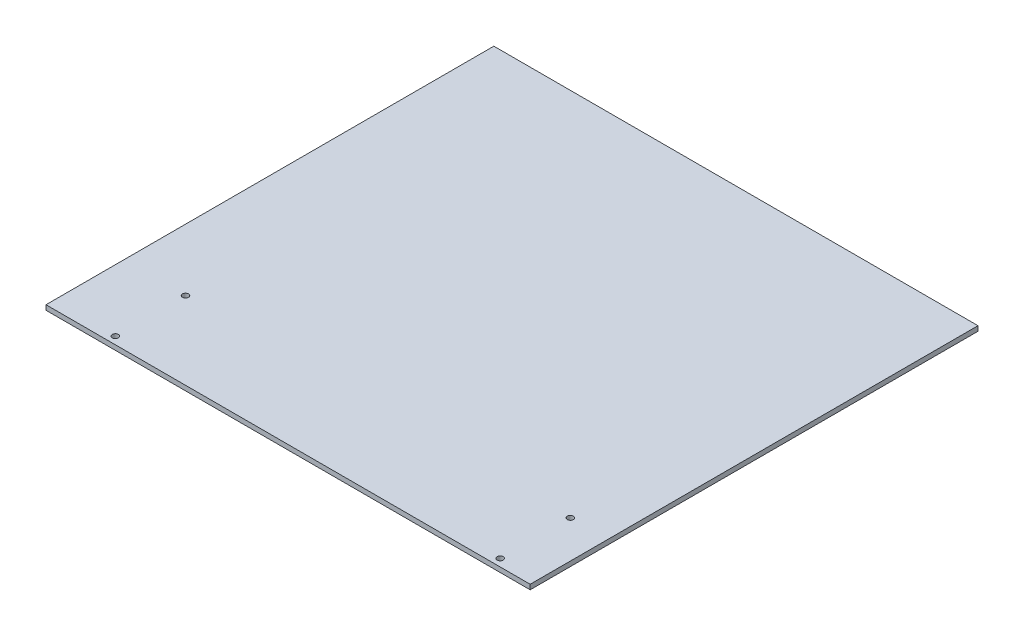
ISO-10303-21;
HEADER;
FILE_DESCRIPTION(('STEP AP214'),'2;1');
FILE_NAME('part.step','',(''),(''),'','','');
FILE_SCHEMA(('AUTOMOTIVE_DESIGN { 1 0 10303 214 1 1 1 1 }'));
ENDSEC;
DATA;
#1=APPLICATION_CONTEXT('core data for automotive mechanical design processes');
#2=APPLICATION_PROTOCOL_DEFINITION('international standard','automotive_design',2000,#1);
#3=PRODUCT_CONTEXT('',#1,'mechanical');
#4=PRODUCT('Part','Part','',(#3));
#5=PRODUCT_RELATED_PRODUCT_CATEGORY('part','',(#4));
#6=PRODUCT_DEFINITION_FORMATION('','',#4);
#7=PRODUCT_DEFINITION_CONTEXT('part definition',#1,'design');
#8=PRODUCT_DEFINITION('design','',#6,#7);
#9=PRODUCT_DEFINITION_SHAPE('','',#8);
#10=(LENGTH_UNIT() NAMED_UNIT(*) SI_UNIT(.MILLI.,.METRE.));
#11=(NAMED_UNIT(*) PLANE_ANGLE_UNIT() SI_UNIT($,.RADIAN.));
#12=(NAMED_UNIT(*) SI_UNIT($,.STERADIAN.) SOLID_ANGLE_UNIT());
#13=UNCERTAINTY_MEASURE_WITH_UNIT(LENGTH_MEASURE(1.E-05),#10,'distance_accuracy_value','');
#14=(GEOMETRIC_REPRESENTATION_CONTEXT(3) GLOBAL_UNCERTAINTY_ASSIGNED_CONTEXT((#13)) GLOBAL_UNIT_ASSIGNED_CONTEXT((#10,
#11,#12)) REPRESENTATION_CONTEXT('',''));
#15=CARTESIAN_POINT('',(0.,0.,0.));
#16=DIRECTION('',(0.,0.,1.));
#17=DIRECTION('',(1.,0.,0.));
#18=AXIS2_PLACEMENT_3D('',#15,#16,#17);
#19=CARTESIAN_POINT('',(100.,2.,92.5));
#20=DIRECTION('',(-1.,0.,0.));
#21=DIRECTION('',(0.,0.,1.));
#22=AXIS2_PLACEMENT_3D('',#19,#20,#21);
#23=PLANE('',#22);
#24=DIRECTION('',(0.,0.,-1.));
#25=VECTOR('',#24,1.);
#26=CARTESIAN_POINT('',(100.,0.,92.5));
#27=LINE('',#26,#25);
#28=CARTESIAN_POINT('',(100.,0.,92.5));
#29=VERTEX_POINT('',#28);
#30=CARTESIAN_POINT('',(100.,0.,-92.5));
#31=VERTEX_POINT('',#30);
#32=EDGE_CURVE('E95',#29,#31,#27,.T.);
#33=ORIENTED_EDGE('',*,*,#32,.T.);
#34=DIRECTION('',(0.,-1.,0.));
#35=VECTOR('',#34,1.);
#36=CARTESIAN_POINT('',(100.,2.,-92.5));
#37=LINE('',#36,#35);
#38=CARTESIAN_POINT('',(100.,2.,-92.5));
#39=VERTEX_POINT('',#38);
#40=EDGE_CURVE('E11',#39,#31,#37,.T.);
#41=ORIENTED_EDGE('',*,*,#40,.F.);
#42=DIRECTION('',(0.,0.,-1.));
#43=VECTOR('',#42,1.);
#44=CARTESIAN_POINT('',(100.,2.,92.5));
#45=LINE('',#44,#43);
#46=CARTESIAN_POINT('',(100.,2.,92.5));
#47=VERTEX_POINT('',#46);
#48=EDGE_CURVE('E83',#47,#39,#45,.T.);
#49=ORIENTED_EDGE('',*,*,#48,.F.);
#50=DIRECTION('',(0.,-1.,0.));
#51=VECTOR('',#50,1.);
#52=CARTESIAN_POINT('',(100.,2.,92.5));
#53=LINE('',#52,#51);
#54=EDGE_CURVE('E91',#47,#29,#53,.T.);
#55=ORIENTED_EDGE('',*,*,#54,.T.);
#56=EDGE_LOOP('',(#33,#41,#49,#55));
#57=FACE_BOUND('',#56,.T.);
#58=ADVANCED_FACE('F32',(#57),#23,.F.);
#59=CARTESIAN_POINT('',(-100.,2.,-92.5));
#60=DIRECTION('',(0.,0.,1.));
#61=DIRECTION('',(1.,0.,0.));
#62=AXIS2_PLACEMENT_3D('',#59,#60,#61);
#63=PLANE('',#62);
#64=DIRECTION('',(-1.,0.,0.));
#65=VECTOR('',#64,1.);
#66=CARTESIAN_POINT('',(-100.,0.,-92.5));
#67=LINE('',#66,#65);
#68=CARTESIAN_POINT('',(-100.,0.,-92.5));
#69=VERTEX_POINT('',#68);
#70=EDGE_CURVE('E87',#31,#69,#67,.T.);
#71=ORIENTED_EDGE('',*,*,#70,.T.);
#72=DIRECTION('',(0.,-1.,0.));
#73=VECTOR('',#72,1.);
#74=CARTESIAN_POINT('',(-100.,2.,-92.5));
#75=LINE('',#74,#73);
#76=CARTESIAN_POINT('',(-100.,2.,-92.5));
#77=VERTEX_POINT('',#76);
#78=EDGE_CURVE('E40',#77,#69,#75,.T.);
#79=ORIENTED_EDGE('',*,*,#78,.F.);
#80=DIRECTION('',(-1.,0.,0.));
#81=VECTOR('',#80,1.);
#82=CARTESIAN_POINT('',(-100.,2.,-92.5));
#83=LINE('',#82,#81);
#84=EDGE_CURVE('E78',#39,#77,#83,.T.);
#85=ORIENTED_EDGE('',*,*,#84,.F.);
#86=ORIENTED_EDGE('',*,*,#40,.T.);
#87=EDGE_LOOP('',(#71,#79,#85,#86));
#88=FACE_BOUND('',#87,.T.);
#89=ADVANCED_FACE('F86',(#88),#63,.F.);
#90=CARTESIAN_POINT('',(-100.,2.,92.5));
#91=DIRECTION('',(1.,0.,0.));
#92=DIRECTION('',(0.,0.,-1.));
#93=AXIS2_PLACEMENT_3D('',#90,#91,#92);
#94=PLANE('',#93);
#95=DIRECTION('',(0.,0.,1.));
#96=VECTOR('',#95,1.);
#97=CARTESIAN_POINT('',(-100.,0.,92.5));
#98=LINE('',#97,#96);
#99=CARTESIAN_POINT('',(-100.,0.,92.5));
#100=VERTEX_POINT('',#99);
#101=EDGE_CURVE('E65',#69,#100,#98,.T.);
#102=ORIENTED_EDGE('',*,*,#101,.T.);
#103=DIRECTION('',(0.,-1.,0.));
#104=VECTOR('',#103,1.);
#105=CARTESIAN_POINT('',(-100.,2.,92.5));
#106=LINE('',#105,#104);
#107=CARTESIAN_POINT('',(-100.,2.,92.5));
#108=VERTEX_POINT('',#107);
#109=EDGE_CURVE('E88',#108,#100,#106,.T.);
#110=ORIENTED_EDGE('',*,*,#109,.F.);
#111=DIRECTION('',(0.,0.,1.));
#112=VECTOR('',#111,1.);
#113=CARTESIAN_POINT('',(-100.,2.,92.5));
#114=LINE('',#113,#112);
#115=EDGE_CURVE('E81',#77,#108,#114,.T.);
#116=ORIENTED_EDGE('',*,*,#115,.F.);
#117=ORIENTED_EDGE('',*,*,#78,.T.);
#118=EDGE_LOOP('',(#102,#110,#116,#117));
#119=FACE_BOUND('',#118,.T.);
#120=ADVANCED_FACE('F89',(#119),#94,.F.);
#121=CARTESIAN_POINT('',(-100.,2.,92.5));
#122=DIRECTION('',(0.,0.,-1.));
#123=DIRECTION('',(-1.,0.,0.));
#124=AXIS2_PLACEMENT_3D('',#121,#122,#123);
#125=PLANE('',#124);
#126=DIRECTION('',(1.,0.,0.));
#127=VECTOR('',#126,1.);
#128=CARTESIAN_POINT('',(-100.,0.,92.5));
#129=LINE('',#128,#127);
#130=EDGE_CURVE('E71',#100,#29,#129,.T.);
#131=ORIENTED_EDGE('',*,*,#130,.T.);
#132=ORIENTED_EDGE('',*,*,#54,.F.);
#133=DIRECTION('',(1.,0.,0.));
#134=VECTOR('',#133,1.);
#135=CARTESIAN_POINT('',(-100.,2.,92.5));
#136=LINE('',#135,#134);
#137=EDGE_CURVE('E48',#108,#47,#136,.T.);
#138=ORIENTED_EDGE('',*,*,#137,.F.);
#139=ORIENTED_EDGE('',*,*,#109,.T.);
#140=EDGE_LOOP('',(#131,#132,#138,#139));
#141=FACE_BOUND('',#140,.T.);
#142=ADVANCED_FACE('F103',(#141),#125,.F.);
#143=CARTESIAN_POINT('',(0.,2.,0.));
#144=DIRECTION('',(0.,-1.,0.));
#145=DIRECTION('',(0.,0.,-1.));
#146=AXIS2_PLACEMENT_3D('',#143,#144,#145);
#147=PLANE('',#146);
#148=CARTESIAN_POINT('',(84.5491280314967,2.,60.4321632087395));
#149=DIRECTION('',(0.,-1.,0.));
#150=DIRECTION('',(0.,0.,-1.));
#151=AXIS2_PLACEMENT_3D('',#148,#149,#150);
#152=CIRCLE('',#151,1.25);
#153=CARTESIAN_POINT('',(84.5491280314967,2.,59.1821632087395));
#154=VERTEX_POINT('',#153);
#155=EDGE_CURVE('E126',#154,#154,#152,.T.);
#156=ORIENTED_EDGE('',*,*,#155,.T.);
#157=EDGE_LOOP('',(#156));
#158=FACE_BOUND('',#157,.T.);
#159=CARTESIAN_POINT('',(84.5491280314967,2.,89.4328255504167));
#160=DIRECTION('',(0.,-1.,0.));
#161=DIRECTION('',(0.,0.,-1.));
#162=AXIS2_PLACEMENT_3D('',#159,#160,#161);
#163=CIRCLE('',#162,1.25);
#164=CARTESIAN_POINT('',(84.5491280314967,2.,88.1828255504167));
#165=VERTEX_POINT('',#164);
#166=EDGE_CURVE('E120',#165,#165,#163,.T.);
#167=ORIENTED_EDGE('',*,*,#166,.T.);
#168=EDGE_LOOP('',(#167));
#169=FACE_BOUND('',#168,.T.);
#170=CARTESIAN_POINT('',(-74.4456046798806,2.,89.4328255504167));
#171=DIRECTION('',(0.,-1.,0.));
#172=DIRECTION('',(0.,0.,-1.));
#173=AXIS2_PLACEMENT_3D('',#170,#171,#172);
#174=CIRCLE('',#173,1.25);
#175=CARTESIAN_POINT('',(-74.4456046798806,2.,88.1828255504167));
#176=VERTEX_POINT('',#175);
#177=EDGE_CURVE('E114',#176,#176,#174,.T.);
#178=ORIENTED_EDGE('',*,*,#177,.T.);
#179=EDGE_LOOP('',(#178));
#180=FACE_BOUND('',#179,.T.);
#181=CARTESIAN_POINT('',(-74.4456046798806,2.,60.4321632087395));
#182=DIRECTION('',(0.,-1.,0.));
#183=DIRECTION('',(0.,0.,-1.));
#184=AXIS2_PLACEMENT_3D('',#181,#182,#183);
#185=CIRCLE('',#184,1.25);
#186=CARTESIAN_POINT('',(-74.4456046798806,2.,59.1821632087395));
#187=VERTEX_POINT('',#186);
#188=EDGE_CURVE('E98',#187,#187,#185,.T.);
#189=ORIENTED_EDGE('',*,*,#188,.T.);
#190=EDGE_LOOP('',(#189));
#191=FACE_BOUND('',#190,.T.);
#192=ORIENTED_EDGE('',*,*,#48,.T.);
#193=ORIENTED_EDGE('',*,*,#84,.T.);
#194=ORIENTED_EDGE('',*,*,#115,.T.);
#195=ORIENTED_EDGE('',*,*,#137,.T.);
#196=EDGE_LOOP('',(#192,#193,#194,#195));
#197=FACE_BOUND('',#196,.T.);
#198=ADVANCED_FACE('F79',(#158,#169,#180,#191,#197),#147,.F.);
#199=CARTESIAN_POINT('',(0.,0.,0.));
#200=DIRECTION('',(0.,-1.,0.));
#201=DIRECTION('',(0.,0.,-1.));
#202=AXIS2_PLACEMENT_3D('',#199,#200,#201);
#203=PLANE('',#202);
#204=CARTESIAN_POINT('',(84.5491280314967,0.,60.4321632087395));
#205=DIRECTION('',(0.,-1.,0.));
#206=DIRECTION('',(0.,0.,-1.));
#207=AXIS2_PLACEMENT_3D('',#204,#205,#206);
#208=CIRCLE('',#207,1.24999999999999);
#209=CARTESIAN_POINT('',(84.5491280314967,0.,59.1821632087395));
#210=VERTEX_POINT('',#209);
#211=EDGE_CURVE('E129',#210,#210,#208,.T.);
#212=ORIENTED_EDGE('',*,*,#211,.F.);
#213=EDGE_LOOP('',(#212));
#214=FACE_BOUND('',#213,.T.);
#215=CARTESIAN_POINT('',(84.5491280314967,0.,89.4328255504167));
#216=DIRECTION('',(0.,-1.,0.));
#217=DIRECTION('',(0.,0.,-1.));
#218=AXIS2_PLACEMENT_3D('',#215,#216,#217);
#219=CIRCLE('',#218,1.24999999999999);
#220=CARTESIAN_POINT('',(84.5491280314967,0.,88.1828255504167));
#221=VERTEX_POINT('',#220);
#222=EDGE_CURVE('E123',#221,#221,#219,.T.);
#223=ORIENTED_EDGE('',*,*,#222,.F.);
#224=EDGE_LOOP('',(#223));
#225=FACE_BOUND('',#224,.T.);
#226=CARTESIAN_POINT('',(-74.4456046798806,0.,89.4328255504167));
#227=DIRECTION('',(0.,-1.,0.));
#228=DIRECTION('',(0.,0.,-1.));
#229=AXIS2_PLACEMENT_3D('',#226,#227,#228);
#230=CIRCLE('',#229,1.24999999999999);
#231=CARTESIAN_POINT('',(-74.4456046798806,0.,88.1828255504167));
#232=VERTEX_POINT('',#231);
#233=EDGE_CURVE('E117',#232,#232,#230,.T.);
#234=ORIENTED_EDGE('',*,*,#233,.F.);
#235=EDGE_LOOP('',(#234));
#236=FACE_BOUND('',#235,.T.);
#237=CARTESIAN_POINT('',(-74.4456046798806,0.,60.4321632087395));
#238=DIRECTION('',(0.,-1.,0.));
#239=DIRECTION('',(0.,0.,-1.));
#240=AXIS2_PLACEMENT_3D('',#237,#238,#239);
#241=CIRCLE('',#240,1.24999999999999);
#242=CARTESIAN_POINT('',(-74.4456046798806,0.,59.1821632087395));
#243=VERTEX_POINT('',#242);
#244=EDGE_CURVE('E111',#243,#243,#241,.T.);
#245=ORIENTED_EDGE('',*,*,#244,.F.);
#246=EDGE_LOOP('',(#245));
#247=FACE_BOUND('',#246,.T.);
#248=ORIENTED_EDGE('',*,*,#32,.F.);
#249=ORIENTED_EDGE('',*,*,#130,.F.);
#250=ORIENTED_EDGE('',*,*,#101,.F.);
#251=ORIENTED_EDGE('',*,*,#70,.F.);
#252=EDGE_LOOP('',(#248,#249,#250,#251));
#253=FACE_BOUND('',#252,.T.);
#254=ADVANCED_FACE('F106',(#214,#225,#236,#247,#253),#203,.T.);
#255=CARTESIAN_POINT('',(-74.4456046798806,0.,60.4321632087395));
#256=DIRECTION('',(0.,-1.,0.));
#257=DIRECTION('',(0.,0.,-1.));
#258=AXIS2_PLACEMENT_3D('',#255,#256,#257);
#259=CYLINDRICAL_SURFACE('',#258,1.24999999999999);
#260=ORIENTED_EDGE('',*,*,#188,.F.);
#261=EDGE_LOOP('',(#260));
#262=FACE_BOUND('',#261,.T.);
#263=ORIENTED_EDGE('',*,*,#244,.T.);
#264=EDGE_LOOP('',(#263));
#265=FACE_BOUND('',#264,.T.);
#266=ADVANCED_FACE('F137',(#262,#265),#259,.F.);
#267=CARTESIAN_POINT('',(-74.4456046798806,0.,89.4328255504167));
#268=DIRECTION('',(0.,-1.,0.));
#269=DIRECTION('',(0.,0.,-1.));
#270=AXIS2_PLACEMENT_3D('',#267,#268,#269);
#271=CYLINDRICAL_SURFACE('',#270,1.24999999999999);
#272=ORIENTED_EDGE('',*,*,#177,.F.);
#273=EDGE_LOOP('',(#272));
#274=FACE_BOUND('',#273,.T.);
#275=ORIENTED_EDGE('',*,*,#233,.T.);
#276=EDGE_LOOP('',(#275));
#277=FACE_BOUND('',#276,.T.);
#278=ADVANCED_FACE('F146',(#274,#277),#271,.F.);
#279=CARTESIAN_POINT('',(84.5491280314967,0.,89.4328255504167));
#280=DIRECTION('',(0.,-1.,0.));
#281=DIRECTION('',(0.,0.,-1.));
#282=AXIS2_PLACEMENT_3D('',#279,#280,#281);
#283=CYLINDRICAL_SURFACE('',#282,1.24999999999999);
#284=ORIENTED_EDGE('',*,*,#166,.F.);
#285=EDGE_LOOP('',(#284));
#286=FACE_BOUND('',#285,.T.);
#287=ORIENTED_EDGE('',*,*,#222,.T.);
#288=EDGE_LOOP('',(#287));
#289=FACE_BOUND('',#288,.T.);
#290=ADVANCED_FACE('F152',(#286,#289),#283,.F.);
#291=CARTESIAN_POINT('',(84.5491280314967,0.,60.4321632087395));
#292=DIRECTION('',(0.,-1.,0.));
#293=DIRECTION('',(0.,0.,-1.));
#294=AXIS2_PLACEMENT_3D('',#291,#292,#293);
#295=CYLINDRICAL_SURFACE('',#294,1.24999999999999);
#296=ORIENTED_EDGE('',*,*,#155,.F.);
#297=EDGE_LOOP('',(#296));
#298=FACE_BOUND('',#297,.T.);
#299=ORIENTED_EDGE('',*,*,#211,.T.);
#300=EDGE_LOOP('',(#299));
#301=FACE_BOUND('',#300,.T.);
#302=ADVANCED_FACE('F133',(#298,#301),#295,.F.);
#303=CLOSED_SHELL('',(#58,#89,#120,#142,#198,#254,#266,#278,#290,#302));
#304=MANIFOLD_SOLID_BREP('B2',#303);
#305=ADVANCED_BREP_SHAPE_REPRESENTATION('',(#18,#304),#14);
#306=SHAPE_DEFINITION_REPRESENTATION(#9,#305);
ENDSEC;
END-ISO-10303-21;
